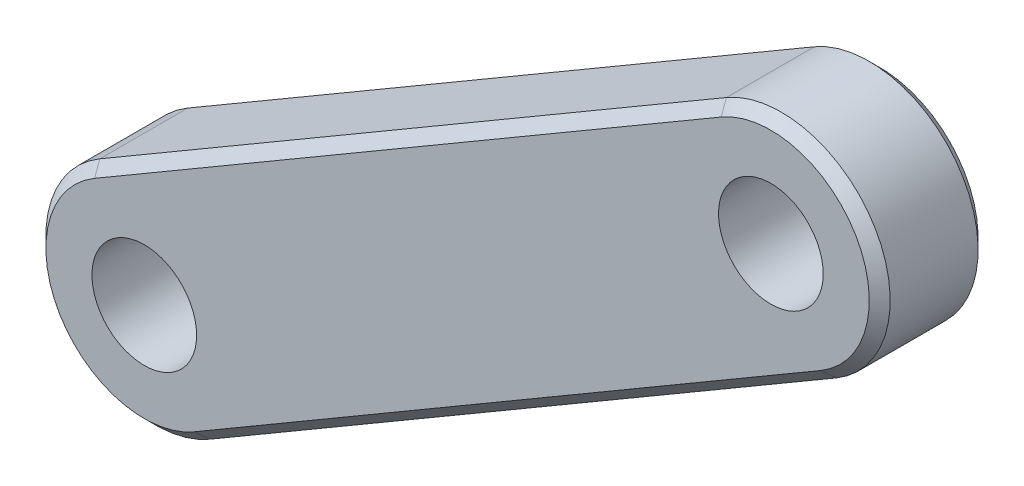
ISO-10303-21;
HEADER;
FILE_DESCRIPTION(('STEP AP214'),'2;1');
FILE_NAME('part.step','',(''),(''),'','','');
FILE_SCHEMA(('AUTOMOTIVE_DESIGN { 1 0 10303 214 1 1 1 1 }'));
ENDSEC;
DATA;
#1=APPLICATION_CONTEXT('core data for automotive mechanical design processes');
#2=APPLICATION_PROTOCOL_DEFINITION('international standard','automotive_design',2000,#1);
#3=PRODUCT_CONTEXT('',#1,'mechanical');
#4=PRODUCT('Part','Part','',(#3));
#5=PRODUCT_RELATED_PRODUCT_CATEGORY('part','',(#4));
#6=PRODUCT_DEFINITION_FORMATION('','',#4);
#7=PRODUCT_DEFINITION_CONTEXT('part definition',#1,'design');
#8=PRODUCT_DEFINITION('design','',#6,#7);
#9=PRODUCT_DEFINITION_SHAPE('','',#8);
#10=(LENGTH_UNIT() NAMED_UNIT(*) SI_UNIT(.MILLI.,.METRE.));
#11=(NAMED_UNIT(*) PLANE_ANGLE_UNIT() SI_UNIT($,.RADIAN.));
#12=(NAMED_UNIT(*) SI_UNIT($,.STERADIAN.) SOLID_ANGLE_UNIT());
#13=UNCERTAINTY_MEASURE_WITH_UNIT(LENGTH_MEASURE(1.E-05),#10,'distance_accuracy_value','');
#14=(GEOMETRIC_REPRESENTATION_CONTEXT(3) GLOBAL_UNCERTAINTY_ASSIGNED_CONTEXT((#13)) GLOBAL_UNIT_ASSIGNED_CONTEXT((#10,
#11,#12)) REPRESENTATION_CONTEXT('',''));
#15=CARTESIAN_POINT('',(0.,0.,0.));
#16=DIRECTION('',(0.,0.,1.));
#17=DIRECTION('',(1.,0.,0.));
#18=AXIS2_PLACEMENT_3D('',#15,#16,#17);
#19=CARTESIAN_POINT('',(29.721847641045,35.6560552041691,8.3));
#20=DIRECTION('',(0.,0.,-1.));
#21=DIRECTION('',(-1.,0.,0.));
#22=AXIS2_PLACEMENT_3D('',#19,#20,#21);
#23=CYLINDRICAL_SURFACE('',#22,5.19999999999999);
#24=DIRECTION('',(0.,0.,-1.));
#25=VECTOR('',#24,1.);
#26=CARTESIAN_POINT('',(32.3466212728657,31.1671173140108,8.3));
#27=LINE('',#26,#25);
#28=CARTESIAN_POINT('',(32.3466212728657,31.1671173140108,7.80000000000001));
#29=VERTEX_POINT('',#28);
#30=CARTESIAN_POINT('',(32.3466212728657,31.1671173140108,3.6));
#31=VERTEX_POINT('',#30);
#32=EDGE_CURVE('E178',#29,#31,#27,.T.);
#33=ORIENTED_EDGE('',*,*,#32,.F.);
#34=CARTESIAN_POINT('',(29.721847641045,35.6560552041691,7.80000000000001));
#35=DIRECTION('',(0.,0.,1.));
#36=DIRECTION('',(1.,0.,0.));
#37=AXIS2_PLACEMENT_3D('',#34,#35,#36);
#38=CIRCLE('',#37,5.19999999999999);
#39=CARTESIAN_POINT('',(27.0970740092244,40.1449930943274,7.80000000000001));
#40=VERTEX_POINT('',#39);
#41=EDGE_CURVE('E122',#29,#40,#38,.F.);
#42=ORIENTED_EDGE('',*,*,#41,.T.);
#43=DIRECTION('',(0.,0.,-1.));
#44=VECTOR('',#43,1.);
#45=CARTESIAN_POINT('',(27.0970740092244,40.1449930943274,8.3));
#46=LINE('',#45,#44);
#47=CARTESIAN_POINT('',(27.0970740092244,40.1449930943274,3.6));
#48=VERTEX_POINT('',#47);
#49=EDGE_CURVE('E130',#40,#48,#46,.T.);
#50=ORIENTED_EDGE('',*,*,#49,.T.);
#51=CARTESIAN_POINT('',(29.721847641045,35.6560552041691,3.6));
#52=DIRECTION('',(0.,0.,1.));
#53=DIRECTION('',(1.,0.,0.));
#54=AXIS2_PLACEMENT_3D('',#51,#52,#53);
#55=CIRCLE('',#54,5.19999999999999);
#56=EDGE_CURVE('E150',#48,#31,#55,.T.);
#57=ORIENTED_EDGE('',*,*,#56,.T.);
#58=EDGE_LOOP('',(#33,#42,#50,#57));
#59=FACE_BOUND('',#58,.T.);
#60=ADVANCED_FACE('F40',(#59),#23,.T.);
#61=CARTESIAN_POINT('',(32.3466212728657,31.1671173140108,8.3));
#62=DIRECTION('',(-0.504764159965509,0.863257286568909,0.));
#63=DIRECTION('',(-0.863257286568909,-0.504764159965509,0.));
#64=AXIS2_PLACEMENT_3D('',#61,#62,#63);
#65=PLANE('',#64);
#66=DIRECTION('',(0.,0.,-1.));
#67=VECTOR('',#66,1.);
#68=CARTESIAN_POINT('',(62.2828158727597,48.6714214825147,8.3));
#69=LINE('',#68,#67);
#70=CARTESIAN_POINT('',(62.2828158727597,48.6714214825147,7.80000000000001));
#71=VERTEX_POINT('',#70);
#72=CARTESIAN_POINT('',(62.2828158727597,48.6714214825147,3.6));
#73=VERTEX_POINT('',#72);
#74=EDGE_CURVE('E222',#71,#73,#69,.T.);
#75=ORIENTED_EDGE('',*,*,#74,.F.);
#76=DIRECTION('',(-0.863257286568909,-0.504764159965509,0.));
#77=VECTOR('',#76,1.);
#78=CARTESIAN_POINT('',(32.3466212728657,31.1671173140108,7.80000000000001));
#79=LINE('',#78,#77);
#80=EDGE_CURVE('E155',#71,#29,#79,.T.);
#81=ORIENTED_EDGE('',*,*,#80,.T.);
#82=ORIENTED_EDGE('',*,*,#32,.T.);
#83=DIRECTION('',(0.863257286568909,0.504764159965509,0.));
#84=VECTOR('',#83,1.);
#85=CARTESIAN_POINT('',(32.3466212728657,31.1671173140108,3.6));
#86=LINE('',#85,#84);
#87=EDGE_CURVE('E153',#31,#73,#86,.T.);
#88=ORIENTED_EDGE('',*,*,#87,.T.);
#89=EDGE_LOOP('',(#75,#81,#82,#88));
#90=FACE_BOUND('',#89,.T.);
#91=ADVANCED_FACE('F202',(#90),#65,.F.);
#92=CARTESIAN_POINT('',(59.6580422409391,53.160359372673,8.3));
#93=DIRECTION('',(0.,0.,-1.));
#94=DIRECTION('',(-1.,0.,0.));
#95=AXIS2_PLACEMENT_3D('',#92,#93,#94);
#96=CYLINDRICAL_SURFACE('',#95,5.2);
#97=DIRECTION('',(0.,0.,-1.));
#98=VECTOR('',#97,1.);
#99=CARTESIAN_POINT('',(57.0332686091184,57.6492972628313,8.3));
#100=LINE('',#99,#98);
#101=CARTESIAN_POINT('',(57.0332686091184,57.6492972628313,7.80000000000001));
#102=VERTEX_POINT('',#101);
#103=CARTESIAN_POINT('',(57.0332686091184,57.6492972628313,3.6));
#104=VERTEX_POINT('',#103);
#105=EDGE_CURVE('E133',#102,#104,#100,.T.);
#106=ORIENTED_EDGE('',*,*,#105,.F.);
#107=CARTESIAN_POINT('',(59.6580422409391,53.160359372673,7.80000000000001));
#108=DIRECTION('',(0.,0.,1.));
#109=DIRECTION('',(1.,0.,0.));
#110=AXIS2_PLACEMENT_3D('',#107,#108,#109);
#111=CIRCLE('',#110,5.2);
#112=EDGE_CURVE('E143',#102,#71,#111,.F.);
#113=ORIENTED_EDGE('',*,*,#112,.T.);
#114=ORIENTED_EDGE('',*,*,#74,.T.);
#115=CARTESIAN_POINT('',(59.6580422409391,53.160359372673,3.6));
#116=DIRECTION('',(0.,0.,1.));
#117=DIRECTION('',(1.,0.,0.));
#118=AXIS2_PLACEMENT_3D('',#115,#116,#117);
#119=CIRCLE('',#118,5.2);
#120=EDGE_CURVE('E140',#73,#104,#119,.T.);
#121=ORIENTED_EDGE('',*,*,#120,.T.);
#122=EDGE_LOOP('',(#106,#113,#114,#121));
#123=FACE_BOUND('',#122,.T.);
#124=ADVANCED_FACE('F198',(#123),#96,.T.);
#125=CARTESIAN_POINT('',(27.0970740092244,40.1449930943274,8.3));
#126=DIRECTION('',(-0.504764159965509,0.863257286568908,0.));
#127=DIRECTION('',(-0.863257286568908,-0.504764159965509,0.));
#128=AXIS2_PLACEMENT_3D('',#125,#126,#127);
#129=PLANE('',#128);
#130=ORIENTED_EDGE('',*,*,#49,.F.);
#131=DIRECTION('',(0.863257286568908,0.504764159965509,0.));
#132=VECTOR('',#131,1.);
#133=CARTESIAN_POINT('',(27.0970740092244,40.1449930943274,7.80000000000001));
#134=LINE('',#133,#132);
#135=EDGE_CURVE('E148',#40,#102,#134,.T.);
#136=ORIENTED_EDGE('',*,*,#135,.T.);
#137=ORIENTED_EDGE('',*,*,#105,.T.);
#138=DIRECTION('',(-0.863257286568908,-0.504764159965509,0.));
#139=VECTOR('',#138,1.);
#140=CARTESIAN_POINT('',(27.0970740092244,40.1449930943274,3.6));
#141=LINE('',#140,#139);
#142=EDGE_CURVE('E146',#104,#48,#141,.T.);
#143=ORIENTED_EDGE('',*,*,#142,.T.);
#144=EDGE_LOOP('',(#130,#136,#137,#143));
#145=FACE_BOUND('',#144,.T.);
#146=ADVANCED_FACE('F191',(#145),#129,.T.);
#147=CARTESIAN_POINT('',(29.721847641045,35.6560552041691,8.3));
#148=DIRECTION('',(0.,0.,1.));
#149=DIRECTION('',(1.,0.,0.));
#150=AXIS2_PLACEMENT_3D('',#147,#148,#149);
#151=PLANE('',#150);
#152=DIRECTION('',(0.863257286568909,0.504764159965509,0.));
#153=VECTOR('',#152,1.);
#154=CARTESIAN_POINT('',(62.0304337927769,49.1030501257991,8.3));
#155=LINE('',#154,#153);
#156=CARTESIAN_POINT('',(32.0942391928829,31.5987459572953,8.3));
#157=VERTEX_POINT('',#156);
#158=CARTESIAN_POINT('',(62.0304337927769,49.1030501257991,8.3));
#159=VERTEX_POINT('',#158);
#160=EDGE_CURVE('E110',#157,#159,#155,.T.);
#161=ORIENTED_EDGE('',*,*,#160,.T.);
#162=CARTESIAN_POINT('',(59.6580422409391,53.160359372673,8.3));
#163=DIRECTION('',(0.,0.,1.));
#164=DIRECTION('',(1.,0.,0.));
#165=AXIS2_PLACEMENT_3D('',#162,#163,#164);
#166=CIRCLE('',#165,4.7);
#167=CARTESIAN_POINT('',(57.2856506891012,57.2176686195469,8.3));
#168=VERTEX_POINT('',#167);
#169=EDGE_CURVE('E138',#159,#168,#166,.T.);
#170=ORIENTED_EDGE('',*,*,#169,.T.);
#171=DIRECTION('',(-0.863257286568908,-0.504764159965509,0.));
#172=VECTOR('',#171,1.);
#173=CARTESIAN_POINT('',(27.3494560892072,39.713364451043,8.3));
#174=LINE('',#173,#172);
#175=CARTESIAN_POINT('',(27.3494560892072,39.713364451043,8.3));
#176=VERTEX_POINT('',#175);
#177=EDGE_CURVE('E113',#168,#176,#174,.T.);
#178=ORIENTED_EDGE('',*,*,#177,.T.);
#179=CARTESIAN_POINT('',(29.721847641045,35.6560552041691,8.3));
#180=DIRECTION('',(0.,0.,1.));
#181=DIRECTION('',(1.,0.,0.));
#182=AXIS2_PLACEMENT_3D('',#179,#180,#181);
#183=CIRCLE('',#182,4.69999999999999);
#184=EDGE_CURVE('E104',#176,#157,#183,.T.);
#185=ORIENTED_EDGE('',*,*,#184,.T.);
#186=EDGE_LOOP('',(#161,#170,#178,#185));
#187=FACE_BOUND('',#186,.T.);
#188=CARTESIAN_POINT('',(29.721847641045,35.6560552041691,8.3));
#189=DIRECTION('',(0.,0.,1.));
#190=DIRECTION('',(1.,0.,0.));
#191=AXIS2_PLACEMENT_3D('',#188,#189,#190);
#192=CIRCLE('',#191,2.5);
#193=CARTESIAN_POINT('',(32.221847641045,35.6560552041691,8.3));
#194=VERTEX_POINT('',#193);
#195=EDGE_CURVE('E179',#194,#194,#192,.T.);
#196=ORIENTED_EDGE('',*,*,#195,.F.);
#197=EDGE_LOOP('',(#196));
#198=FACE_BOUND('',#197,.T.);
#199=CARTESIAN_POINT('',(59.6580422409391,53.160359372673,8.3));
#200=DIRECTION('',(0.,0.,1.));
#201=DIRECTION('',(1.,0.,0.));
#202=AXIS2_PLACEMENT_3D('',#199,#200,#201);
#203=CIRCLE('',#202,2.50000000000001);
#204=CARTESIAN_POINT('',(62.1580422409391,53.160359372673,8.3));
#205=VERTEX_POINT('',#204);
#206=EDGE_CURVE('E44',#205,#205,#203,.T.);
#207=ORIENTED_EDGE('',*,*,#206,.F.);
#208=EDGE_LOOP('',(#207));
#209=FACE_BOUND('',#208,.T.);
#210=ADVANCED_FACE('F106',(#187,#198,#209),#151,.T.);
#211=CARTESIAN_POINT('',(29.721847641045,35.6560552041691,3.1));
#212=DIRECTION('',(0.,0.,1.));
#213=DIRECTION('',(1.,0.,0.));
#214=AXIS2_PLACEMENT_3D('',#211,#212,#213);
#215=PLANE('',#214);
#216=DIRECTION('',(0.863257286568908,0.504764159965509,0.));
#217=VECTOR('',#216,1.);
#218=CARTESIAN_POINT('',(57.2856506891012,57.2176686195469,3.1));
#219=LINE('',#218,#217);
#220=CARTESIAN_POINT('',(27.3494560892072,39.713364451043,3.1));
#221=VERTEX_POINT('',#220);
#222=CARTESIAN_POINT('',(57.2856506891012,57.2176686195469,3.1));
#223=VERTEX_POINT('',#222);
#224=EDGE_CURVE('E49',#221,#223,#219,.T.);
#225=ORIENTED_EDGE('',*,*,#224,.T.);
#226=CARTESIAN_POINT('',(59.6580422409391,53.160359372673,3.1));
#227=DIRECTION('',(0.,0.,1.));
#228=DIRECTION('',(1.,0.,0.));
#229=AXIS2_PLACEMENT_3D('',#226,#227,#228);
#230=CIRCLE('',#229,4.69999999999999);
#231=CARTESIAN_POINT('',(62.0304337927769,49.1030501257992,3.1));
#232=VERTEX_POINT('',#231);
#233=EDGE_CURVE('E12',#223,#232,#230,.F.);
#234=ORIENTED_EDGE('',*,*,#233,.T.);
#235=DIRECTION('',(-0.863257286568909,-0.504764159965509,0.));
#236=VECTOR('',#235,1.);
#237=CARTESIAN_POINT('',(32.0942391928829,31.5987459572953,3.1));
#238=LINE('',#237,#236);
#239=CARTESIAN_POINT('',(32.0942391928829,31.5987459572953,3.1));
#240=VERTEX_POINT('',#239);
#241=EDGE_CURVE('E157',#232,#240,#238,.T.);
#242=ORIENTED_EDGE('',*,*,#241,.T.);
#243=CARTESIAN_POINT('',(29.721847641045,35.6560552041691,3.1));
#244=DIRECTION('',(0.,0.,1.));
#245=DIRECTION('',(1.,0.,0.));
#246=AXIS2_PLACEMENT_3D('',#243,#244,#245);
#247=CIRCLE('',#246,4.69999999999998);
#248=EDGE_CURVE('E60',#240,#221,#247,.F.);
#249=ORIENTED_EDGE('',*,*,#248,.T.);
#250=EDGE_LOOP('',(#225,#234,#242,#249));
#251=FACE_BOUND('',#250,.T.);
#252=CARTESIAN_POINT('',(29.721847641045,35.6560552041691,3.1));
#253=DIRECTION('',(0.,0.,1.));
#254=DIRECTION('',(1.,0.,0.));
#255=AXIS2_PLACEMENT_3D('',#252,#253,#254);
#256=CIRCLE('',#255,2.5);
#257=CARTESIAN_POINT('',(32.221847641045,35.6560552041691,3.1));
#258=VERTEX_POINT('',#257);
#259=EDGE_CURVE('E175',#258,#258,#256,.T.);
#260=ORIENTED_EDGE('',*,*,#259,.T.);
#261=EDGE_LOOP('',(#260));
#262=FACE_BOUND('',#261,.T.);
#263=CARTESIAN_POINT('',(59.6580422409391,53.160359372673,3.1));
#264=DIRECTION('',(0.,0.,1.));
#265=DIRECTION('',(1.,0.,0.));
#266=AXIS2_PLACEMENT_3D('',#263,#264,#265);
#267=CIRCLE('',#266,2.50000000000001);
#268=CARTESIAN_POINT('',(62.1580422409391,53.160359372673,3.1));
#269=VERTEX_POINT('',#268);
#270=EDGE_CURVE('E181',#269,#269,#267,.T.);
#271=ORIENTED_EDGE('',*,*,#270,.T.);
#272=EDGE_LOOP('',(#271));
#273=FACE_BOUND('',#272,.T.);
#274=ADVANCED_FACE('F190',(#251,#262,#273),#215,.F.);
#275=CARTESIAN_POINT('',(59.6580422409391,53.160359372673,5.7));
#276=DIRECTION('',(0.,0.,1.));
#277=DIRECTION('',(1.,0.,0.));
#278=AXIS2_PLACEMENT_3D('',#275,#276,#277);
#279=CYLINDRICAL_SURFACE('',#278,2.50000000000001);
#280=ORIENTED_EDGE('',*,*,#270,.F.);
#281=EDGE_LOOP('',(#280));
#282=FACE_BOUND('',#281,.T.);
#283=ORIENTED_EDGE('',*,*,#206,.T.);
#284=EDGE_LOOP('',(#283));
#285=FACE_BOUND('',#284,.T.);
#286=ADVANCED_FACE('F42',(#282,#285),#279,.F.);
#287=CARTESIAN_POINT('',(29.721847641045,35.6560552041691,5.7));
#288=DIRECTION('',(0.,0.,1.));
#289=DIRECTION('',(1.,0.,0.));
#290=AXIS2_PLACEMENT_3D('',#287,#288,#289);
#291=CYLINDRICAL_SURFACE('',#290,2.5);
#292=ORIENTED_EDGE('',*,*,#259,.F.);
#293=EDGE_LOOP('',(#292));
#294=FACE_BOUND('',#293,.T.);
#295=ORIENTED_EDGE('',*,*,#195,.T.);
#296=EDGE_LOOP('',(#295));
#297=FACE_BOUND('',#296,.T.);
#298=ADVANCED_FACE('F266',(#294,#297),#291,.F.);
#299=CARTESIAN_POINT('',(29.721847641045,35.6560552041691,8.3));
#300=DIRECTION('',(0.,0.,-1.));
#301=DIRECTION('',(-1.,0.,0.));
#302=AXIS2_PLACEMENT_3D('',#299,#300,#301);
#303=CONICAL_SURFACE('',#302,4.69999999999999,0.785398163397453);
#304=DIRECTION('',(0.356922160411545,-0.61041508124158,0.707106781186541));
#305=VECTOR('',#304,1.);
#306=CARTESIAN_POINT('',(27.0970740092244,40.1449930943274,7.80000000000001));
#307=LINE('',#306,#305);
#308=EDGE_CURVE('E125',#40,#176,#307,.T.);
#309=ORIENTED_EDGE('',*,*,#308,.F.);
#310=ORIENTED_EDGE('',*,*,#41,.F.);
#311=DIRECTION('',(0.356922160411541,-0.610415081241581,-0.707106781186542));
#312=VECTOR('',#311,1.);
#313=CARTESIAN_POINT('',(32.0942391928829,31.5987459572953,8.3));
#314=LINE('',#313,#312);
#315=EDGE_CURVE('E120',#157,#29,#314,.T.);
#316=ORIENTED_EDGE('',*,*,#315,.F.);
#317=ORIENTED_EDGE('',*,*,#184,.F.);
#318=EDGE_LOOP('',(#309,#310,#316,#317));
#319=FACE_BOUND('',#318,.T.);
#320=ADVANCED_FACE('F121',(#319),#303,.T.);
#321=CARTESIAN_POINT('',(32.0942391928829,31.5987459572953,8.3));
#322=DIRECTION('',(0.356922160411541,-0.610415081241571,0.707106781186551));
#323=DIRECTION('',(-0.863257286568909,-0.504764159965509,0.));
#324=AXIS2_PLACEMENT_3D('',#321,#322,#323);
#325=PLANE('',#324);
#326=ORIENTED_EDGE('',*,*,#315,.T.);
#327=ORIENTED_EDGE('',*,*,#80,.F.);
#328=DIRECTION('',(0.356922160411541,-0.610415081241581,-0.707106781186542));
#329=VECTOR('',#328,1.);
#330=CARTESIAN_POINT('',(62.0304337927769,49.1030501257991,8.3));
#331=LINE('',#330,#329);
#332=EDGE_CURVE('E128',#159,#71,#331,.T.);
#333=ORIENTED_EDGE('',*,*,#332,.F.);
#334=ORIENTED_EDGE('',*,*,#160,.F.);
#335=EDGE_LOOP('',(#326,#327,#333,#334));
#336=FACE_BOUND('',#335,.T.);
#337=ADVANCED_FACE('F127',(#336),#325,.T.);
#338=CARTESIAN_POINT('',(27.0970740092244,40.1449930943274,7.80000000000001));
#339=DIRECTION('',(0.356922160411539,-0.610415081241568,-0.707106781186554));
#340=DIRECTION('',(0.863257286568908,0.504764159965509,0.));
#341=AXIS2_PLACEMENT_3D('',#338,#339,#340);
#342=PLANE('',#341);
#343=ORIENTED_EDGE('',*,*,#308,.T.);
#344=ORIENTED_EDGE('',*,*,#177,.F.);
#345=DIRECTION('',(0.356922160411542,-0.610415081241583,0.70710678118654));
#346=VECTOR('',#345,1.);
#347=CARTESIAN_POINT('',(57.0332686091184,57.6492972628313,7.80000000000001));
#348=LINE('',#347,#346);
#349=EDGE_CURVE('E161',#102,#168,#348,.T.);
#350=ORIENTED_EDGE('',*,*,#349,.F.);
#351=ORIENTED_EDGE('',*,*,#135,.F.);
#352=EDGE_LOOP('',(#343,#344,#350,#351));
#353=FACE_BOUND('',#352,.T.);
#354=ADVANCED_FACE('F228',(#353),#342,.F.);
#355=CARTESIAN_POINT('',(59.6580422409391,53.160359372673,8.3));
#356=DIRECTION('',(0.,0.,-1.));
#357=DIRECTION('',(-1.,0.,0.));
#358=AXIS2_PLACEMENT_3D('',#355,#356,#357);
#359=CONICAL_SURFACE('',#358,4.7,0.785398163397458);
#360=ORIENTED_EDGE('',*,*,#332,.T.);
#361=ORIENTED_EDGE('',*,*,#112,.F.);
#362=ORIENTED_EDGE('',*,*,#349,.T.);
#363=ORIENTED_EDGE('',*,*,#169,.F.);
#364=EDGE_LOOP('',(#360,#361,#362,#363));
#365=FACE_BOUND('',#364,.T.);
#366=ADVANCED_FACE('F225',(#365),#359,.T.);
#367=CARTESIAN_POINT('',(29.721847641045,35.6560552041691,3.6));
#368=DIRECTION('',(0.,0.,1.));
#369=DIRECTION('',(1.,0.,0.));
#370=AXIS2_PLACEMENT_3D('',#367,#368,#369);
#371=CONICAL_SURFACE('',#370,5.19999999999999,0.785398163397454);
#372=DIRECTION('',(-0.356922160411547,0.610415081241575,0.707106781186545));
#373=VECTOR('',#372,1.);
#374=CARTESIAN_POINT('',(27.3494560892072,39.713364451043,3.1));
#375=LINE('',#374,#373);
#376=EDGE_CURVE('E170',#221,#48,#375,.T.);
#377=ORIENTED_EDGE('',*,*,#376,.F.);
#378=ORIENTED_EDGE('',*,*,#248,.F.);
#379=DIRECTION('',(-0.356922160411547,0.610415081241575,-0.707106781186545));
#380=VECTOR('',#379,1.);
#381=CARTESIAN_POINT('',(32.3466212728657,31.1671173140108,3.6));
#382=LINE('',#381,#380);
#383=EDGE_CURVE('E163',#31,#240,#382,.T.);
#384=ORIENTED_EDGE('',*,*,#383,.F.);
#385=ORIENTED_EDGE('',*,*,#56,.F.);
#386=EDGE_LOOP('',(#377,#378,#384,#385));
#387=FACE_BOUND('',#386,.T.);
#388=ADVANCED_FACE('F235',(#387),#371,.T.);
#389=CARTESIAN_POINT('',(32.3466212728657,31.1671173140108,3.6));
#390=DIRECTION('',(-0.35692216041154,0.610415081241569,0.707106781186553));
#391=DIRECTION('',(0.863257286568909,0.504764159965509,0.));
#392=AXIS2_PLACEMENT_3D('',#389,#390,#391);
#393=PLANE('',#392);
#394=ORIENTED_EDGE('',*,*,#383,.T.);
#395=ORIENTED_EDGE('',*,*,#241,.F.);
#396=DIRECTION('',(-0.356922160411545,0.610415081241581,-0.70710678118654));
#397=VECTOR('',#396,1.);
#398=CARTESIAN_POINT('',(62.2828158727597,48.6714214825147,3.6));
#399=LINE('',#398,#397);
#400=EDGE_CURVE('E168',#73,#232,#399,.T.);
#401=ORIENTED_EDGE('',*,*,#400,.F.);
#402=ORIENTED_EDGE('',*,*,#87,.F.);
#403=EDGE_LOOP('',(#394,#395,#401,#402));
#404=FACE_BOUND('',#403,.T.);
#405=ADVANCED_FACE('F246',(#404),#393,.F.);
#406=CARTESIAN_POINT('',(27.3494560892072,39.713364451043,3.1));
#407=DIRECTION('',(-0.356922160411542,0.610415081241572,-0.707106781186549));
#408=DIRECTION('',(-0.863257286568908,-0.504764159965509,0.));
#409=AXIS2_PLACEMENT_3D('',#406,#407,#408);
#410=PLANE('',#409);
#411=ORIENTED_EDGE('',*,*,#376,.T.);
#412=ORIENTED_EDGE('',*,*,#142,.F.);
#413=DIRECTION('',(-0.356922160411541,0.61041508124157,0.707106781186551));
#414=VECTOR('',#413,1.);
#415=CARTESIAN_POINT('',(57.2856506891012,57.2176686195469,3.1));
#416=LINE('',#415,#414);
#417=EDGE_CURVE('E166',#223,#104,#416,.T.);
#418=ORIENTED_EDGE('',*,*,#417,.F.);
#419=ORIENTED_EDGE('',*,*,#224,.F.);
#420=EDGE_LOOP('',(#411,#412,#418,#419));
#421=FACE_BOUND('',#420,.T.);
#422=ADVANCED_FACE('F238',(#421),#410,.T.);
#423=CARTESIAN_POINT('',(59.6580422409391,53.160359372673,3.6));
#424=DIRECTION('',(0.,0.,1.));
#425=DIRECTION('',(1.,0.,0.));
#426=AXIS2_PLACEMENT_3D('',#423,#424,#425);
#427=CONICAL_SURFACE('',#426,5.2,0.785398163397458);
#428=ORIENTED_EDGE('',*,*,#400,.T.);
#429=ORIENTED_EDGE('',*,*,#233,.F.);
#430=ORIENTED_EDGE('',*,*,#417,.T.);
#431=ORIENTED_EDGE('',*,*,#120,.F.);
#432=EDGE_LOOP('',(#428,#429,#430,#431));
#433=FACE_BOUND('',#432,.T.);
#434=ADVANCED_FACE('F241',(#433),#427,.T.);
#435=CLOSED_SHELL('',(#60,#91,#124,#146,#210,#274,#286,#298,#320,#337,#354,#366,#388,#405,#422,#434));
#436=MANIFOLD_SOLID_BREP('B2',#435);
#437=ADVANCED_BREP_SHAPE_REPRESENTATION('',(#18,#436),#14);
#438=SHAPE_DEFINITION_REPRESENTATION(#9,#437);
ENDSEC;
END-ISO-10303-21;
